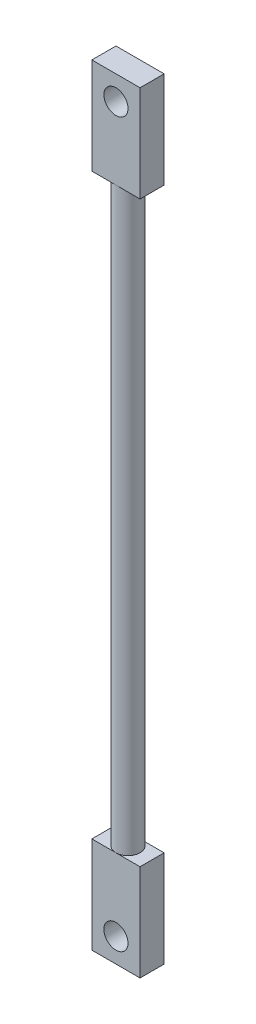
ISO-10303-21;
HEADER;
FILE_DESCRIPTION(('STEP AP214'),'2;1');
FILE_NAME('part.step','',(''),(''),'','','');
FILE_SCHEMA(('AUTOMOTIVE_DESIGN { 1 0 10303 214 1 1 1 1 }'));
ENDSEC;
DATA;
#1=APPLICATION_CONTEXT('core data for automotive mechanical design processes');
#2=APPLICATION_PROTOCOL_DEFINITION('international standard','automotive_design',2000,#1);
#3=PRODUCT_CONTEXT('',#1,'mechanical');
#4=PRODUCT('Part','Part','',(#3));
#5=PRODUCT_RELATED_PRODUCT_CATEGORY('part','',(#4));
#6=PRODUCT_DEFINITION_FORMATION('','',#4);
#7=PRODUCT_DEFINITION_CONTEXT('part definition',#1,'design');
#8=PRODUCT_DEFINITION('design','',#6,#7);
#9=PRODUCT_DEFINITION_SHAPE('','',#8);
#10=(LENGTH_UNIT() NAMED_UNIT(*) SI_UNIT(.MILLI.,.METRE.));
#11=(NAMED_UNIT(*) PLANE_ANGLE_UNIT() SI_UNIT($,.RADIAN.));
#12=(NAMED_UNIT(*) SI_UNIT($,.STERADIAN.) SOLID_ANGLE_UNIT());
#13=UNCERTAINTY_MEASURE_WITH_UNIT(LENGTH_MEASURE(1.E-05),#10,'distance_accuracy_value','');
#14=(GEOMETRIC_REPRESENTATION_CONTEXT(3) GLOBAL_UNCERTAINTY_ASSIGNED_CONTEXT((#13)) GLOBAL_UNIT_ASSIGNED_CONTEXT((#10,
#11,#12)) REPRESENTATION_CONTEXT('',''));
#15=CARTESIAN_POINT('',(0.,0.,0.));
#16=DIRECTION('',(0.,0.,1.));
#17=DIRECTION('',(1.,0.,0.));
#18=AXIS2_PLACEMENT_3D('',#15,#16,#17);
#19=CARTESIAN_POINT('',(0.,38.1,0.));
#20=DIRECTION('',(0.,-1.,0.));
#21=DIRECTION('',(0.,0.,-1.));
#22=AXIS2_PLACEMENT_3D('',#19,#20,#21);
#23=CYLINDRICAL_SURFACE('',#22,1.5875);
#24=CARTESIAN_POINT('',(0.,38.1,0.));
#25=DIRECTION('',(0.,1.,0.));
#26=DIRECTION('',(0.,0.,1.));
#27=AXIS2_PLACEMENT_3D('',#24,#25,#26);
#28=CIRCLE('',#27,1.5875);
#29=CARTESIAN_POINT('',(0.,38.1,1.5875));
#30=VERTEX_POINT('',#29);
#31=CARTESIAN_POINT('',(0.,38.1,-1.5875));
#32=VERTEX_POINT('',#31);
#33=EDGE_CURVE('E11',#30,#32,#28,.T.);
#34=ORIENTED_EDGE('',*,*,#33,.F.);
#35=EDGE_CURVE('E47',#32,#30,#28,.T.);
#36=ORIENTED_EDGE('',*,*,#35,.F.);
#37=EDGE_LOOP('',(#34,#36));
#38=FACE_BOUND('',#37,.T.);
#39=CARTESIAN_POINT('',(0.,-38.1,0.));
#40=DIRECTION('',(0.,1.,0.));
#41=DIRECTION('',(0.,0.,1.));
#42=AXIS2_PLACEMENT_3D('',#39,#40,#41);
#43=CIRCLE('',#42,1.5875);
#44=CARTESIAN_POINT('',(0.,-38.1,1.5875));
#45=VERTEX_POINT('',#44);
#46=CARTESIAN_POINT('',(0.,-38.1,-1.5875));
#47=VERTEX_POINT('',#46);
#48=EDGE_CURVE('E172',#45,#47,#43,.T.);
#49=ORIENTED_EDGE('',*,*,#48,.T.);
#50=EDGE_CURVE('E126',#47,#45,#43,.T.);
#51=ORIENTED_EDGE('',*,*,#50,.T.);
#52=EDGE_LOOP('',(#49,#51));
#53=FACE_BOUND('',#52,.T.);
#54=ADVANCED_FACE('F39',(#38,#53),#23,.T.);
#55=CARTESIAN_POINT('',(0.,38.1,0.));
#56=DIRECTION('',(0.,-1.,0.));
#57=DIRECTION('',(0.,0.,-1.));
#58=AXIS2_PLACEMENT_3D('',#55,#56,#57);
#59=PLANE('',#58);
#60=DIRECTION('',(1.,0.,0.));
#61=VECTOR('',#60,1.);
#62=CARTESIAN_POINT('',(-3.175,38.1,1.5875));
#63=LINE('',#62,#61);
#64=CARTESIAN_POINT('',(3.175,38.1,1.5875));
#65=VERTEX_POINT('',#64);
#66=EDGE_CURVE('E211',#30,#65,#63,.T.);
#67=ORIENTED_EDGE('',*,*,#66,.F.);
#68=ORIENTED_EDGE('',*,*,#33,.T.);
#69=DIRECTION('',(-1.,0.,0.));
#70=VECTOR('',#69,1.);
#71=CARTESIAN_POINT('',(-3.175,38.1,-1.5875));
#72=LINE('',#71,#70);
#73=CARTESIAN_POINT('',(3.175,38.1,-1.5875));
#74=VERTEX_POINT('',#73);
#75=EDGE_CURVE('E204',#74,#32,#72,.T.);
#76=ORIENTED_EDGE('',*,*,#75,.F.);
#77=DIRECTION('',(0.,0.,-1.));
#78=VECTOR('',#77,1.);
#79=CARTESIAN_POINT('',(3.175,38.1,1.5875));
#80=LINE('',#79,#78);
#81=EDGE_CURVE('E181',#65,#74,#80,.T.);
#82=ORIENTED_EDGE('',*,*,#81,.F.);
#83=EDGE_LOOP('',(#67,#68,#76,#82));
#84=FACE_BOUND('',#83,.T.);
#85=ADVANCED_FACE('F239',(#84),#59,.T.);
#86=CARTESIAN_POINT('',(3.175,50.8,1.5875));
#87=DIRECTION('',(-1.,0.,0.));
#88=DIRECTION('',(0.,0.,1.));
#89=AXIS2_PLACEMENT_3D('',#86,#87,#88);
#90=PLANE('',#89);
#91=ORIENTED_EDGE('',*,*,#81,.T.);
#92=DIRECTION('',(0.,-1.,0.));
#93=VECTOR('',#92,1.);
#94=CARTESIAN_POINT('',(3.175,50.8,-1.5875));
#95=LINE('',#94,#93);
#96=CARTESIAN_POINT('',(3.175,50.8,-1.5875));
#97=VERTEX_POINT('',#96);
#98=EDGE_CURVE('E225',#97,#74,#95,.T.);
#99=ORIENTED_EDGE('',*,*,#98,.F.);
#100=DIRECTION('',(0.,0.,-1.));
#101=VECTOR('',#100,1.);
#102=CARTESIAN_POINT('',(3.175,50.8,1.5875));
#103=LINE('',#102,#101);
#104=CARTESIAN_POINT('',(3.175,50.8,1.5875));
#105=VERTEX_POINT('',#104);
#106=EDGE_CURVE('E185',#105,#97,#103,.T.);
#107=ORIENTED_EDGE('',*,*,#106,.F.);
#108=DIRECTION('',(0.,-1.,0.));
#109=VECTOR('',#108,1.);
#110=CARTESIAN_POINT('',(3.175,50.8,1.5875));
#111=LINE('',#110,#109);
#112=EDGE_CURVE('E199',#105,#65,#111,.T.);
#113=ORIENTED_EDGE('',*,*,#112,.T.);
#114=EDGE_LOOP('',(#91,#99,#107,#113));
#115=FACE_BOUND('',#114,.T.);
#116=ADVANCED_FACE('F287',(#115),#90,.F.);
#117=CARTESIAN_POINT('',(-3.175,50.8,-1.5875));
#118=DIRECTION('',(0.,0.,1.));
#119=DIRECTION('',(1.,0.,0.));
#120=AXIS2_PLACEMENT_3D('',#117,#118,#119);
#121=PLANE('',#120);
#122=CARTESIAN_POINT('',(0.,47.625,-1.5875));
#123=DIRECTION('',(0.,0.,-1.));
#124=DIRECTION('',(-1.,0.,0.));
#125=AXIS2_PLACEMENT_3D('',#122,#123,#124);
#126=CIRCLE('',#125,1.5875);
#127=CARTESIAN_POINT('',(-1.5875,47.625,-1.5875));
#128=VERTEX_POINT('',#127);
#129=EDGE_CURVE('E176',#128,#128,#126,.T.);
#130=ORIENTED_EDGE('',*,*,#129,.F.);
#131=EDGE_LOOP('',(#130));
#132=FACE_BOUND('',#131,.T.);
#133=ORIENTED_EDGE('',*,*,#75,.T.);
#134=CARTESIAN_POINT('',(-3.175,38.1,-1.5875));
#135=VERTEX_POINT('',#134);
#136=EDGE_CURVE('E203',#32,#135,#72,.T.);
#137=ORIENTED_EDGE('',*,*,#136,.T.);
#138=DIRECTION('',(0.,-1.,0.));
#139=VECTOR('',#138,1.);
#140=CARTESIAN_POINT('',(-3.175,50.8,-1.5875));
#141=LINE('',#140,#139);
#142=CARTESIAN_POINT('',(-3.175,50.8,-1.5875));
#143=VERTEX_POINT('',#142);
#144=EDGE_CURVE('E222',#143,#135,#141,.T.);
#145=ORIENTED_EDGE('',*,*,#144,.F.);
#146=DIRECTION('',(-1.,0.,0.));
#147=VECTOR('',#146,1.);
#148=CARTESIAN_POINT('',(-3.175,50.8,-1.5875));
#149=LINE('',#148,#147);
#150=EDGE_CURVE('E189',#97,#143,#149,.T.);
#151=ORIENTED_EDGE('',*,*,#150,.F.);
#152=ORIENTED_EDGE('',*,*,#98,.T.);
#153=EDGE_LOOP('',(#133,#137,#145,#151,#152));
#154=FACE_BOUND('',#153,.T.);
#155=ADVANCED_FACE('F250',(#132,#154),#121,.F.);
#156=CARTESIAN_POINT('',(-3.175,50.8,1.5875));
#157=DIRECTION('',(1.,0.,0.));
#158=DIRECTION('',(0.,0.,-1.));
#159=AXIS2_PLACEMENT_3D('',#156,#157,#158);
#160=PLANE('',#159);
#161=DIRECTION('',(0.,0.,1.));
#162=VECTOR('',#161,1.);
#163=CARTESIAN_POINT('',(-3.175,38.1,1.5875));
#164=LINE('',#163,#162);
#165=CARTESIAN_POINT('',(-3.175,38.1,1.5875));
#166=VERTEX_POINT('',#165);
#167=EDGE_CURVE('E208',#135,#166,#164,.T.);
#168=ORIENTED_EDGE('',*,*,#167,.T.);
#169=DIRECTION('',(0.,-1.,0.));
#170=VECTOR('',#169,1.);
#171=CARTESIAN_POINT('',(-3.175,50.8,1.5875));
#172=LINE('',#171,#170);
#173=CARTESIAN_POINT('',(-3.175,50.8,1.5875));
#174=VERTEX_POINT('',#173);
#175=EDGE_CURVE('E218',#174,#166,#172,.T.);
#176=ORIENTED_EDGE('',*,*,#175,.F.);
#177=DIRECTION('',(0.,0.,1.));
#178=VECTOR('',#177,1.);
#179=CARTESIAN_POINT('',(-3.175,50.8,1.5875));
#180=LINE('',#179,#178);
#181=EDGE_CURVE('E193',#143,#174,#180,.T.);
#182=ORIENTED_EDGE('',*,*,#181,.F.);
#183=ORIENTED_EDGE('',*,*,#144,.T.);
#184=EDGE_LOOP('',(#168,#176,#182,#183));
#185=FACE_BOUND('',#184,.T.);
#186=ADVANCED_FACE('F248',(#185),#160,.F.);
#187=CARTESIAN_POINT('',(-3.175,50.8,1.5875));
#188=DIRECTION('',(0.,0.,-1.));
#189=DIRECTION('',(-1.,0.,0.));
#190=AXIS2_PLACEMENT_3D('',#187,#188,#189);
#191=PLANE('',#190);
#192=CARTESIAN_POINT('',(0.,47.625,1.5875));
#193=DIRECTION('',(0.,0.,-1.));
#194=DIRECTION('',(-1.,0.,0.));
#195=AXIS2_PLACEMENT_3D('',#192,#193,#194);
#196=CIRCLE('',#195,1.5875);
#197=CARTESIAN_POINT('',(-1.5875,47.625,1.5875));
#198=VERTEX_POINT('',#197);
#199=EDGE_CURVE('E177',#198,#198,#196,.T.);
#200=ORIENTED_EDGE('',*,*,#199,.T.);
#201=EDGE_LOOP('',(#200));
#202=FACE_BOUND('',#201,.T.);
#203=EDGE_CURVE('E190',#166,#30,#63,.T.);
#204=ORIENTED_EDGE('',*,*,#203,.T.);
#205=ORIENTED_EDGE('',*,*,#66,.T.);
#206=ORIENTED_EDGE('',*,*,#112,.F.);
#207=DIRECTION('',(1.,0.,0.));
#208=VECTOR('',#207,1.);
#209=CARTESIAN_POINT('',(-3.175,50.8,1.5875));
#210=LINE('',#209,#208);
#211=EDGE_CURVE('E196',#174,#105,#210,.T.);
#212=ORIENTED_EDGE('',*,*,#211,.F.);
#213=ORIENTED_EDGE('',*,*,#175,.T.);
#214=EDGE_LOOP('',(#204,#205,#206,#212,#213));
#215=FACE_BOUND('',#214,.T.);
#216=ADVANCED_FACE('F243',(#202,#215),#191,.F.);
#217=CARTESIAN_POINT('',(0.,50.8,0.));
#218=DIRECTION('',(0.,-1.,0.));
#219=DIRECTION('',(0.,0.,-1.));
#220=AXIS2_PLACEMENT_3D('',#217,#218,#219);
#221=PLANE('',#220);
#222=ORIENTED_EDGE('',*,*,#106,.T.);
#223=ORIENTED_EDGE('',*,*,#150,.T.);
#224=ORIENTED_EDGE('',*,*,#181,.T.);
#225=ORIENTED_EDGE('',*,*,#211,.T.);
#226=EDGE_LOOP('',(#222,#223,#224,#225));
#227=FACE_BOUND('',#226,.T.);
#228=ADVANCED_FACE('F297',(#227),#221,.F.);
#229=ORIENTED_EDGE('',*,*,#136,.F.);
#230=ORIENTED_EDGE('',*,*,#35,.T.);
#231=ORIENTED_EDGE('',*,*,#203,.F.);
#232=ORIENTED_EDGE('',*,*,#167,.F.);
#233=EDGE_LOOP('',(#229,#230,#231,#232));
#234=FACE_BOUND('',#233,.T.);
#235=ADVANCED_FACE('F235',(#234),#59,.T.);
#236=CARTESIAN_POINT('',(0.,47.625,1.5875));
#237=DIRECTION('',(0.,0.,-1.));
#238=DIRECTION('',(-1.,0.,0.));
#239=AXIS2_PLACEMENT_3D('',#236,#237,#238);
#240=CYLINDRICAL_SURFACE('',#239,1.5875);
#241=ORIENTED_EDGE('',*,*,#199,.F.);
#242=EDGE_LOOP('',(#241));
#243=FACE_BOUND('',#242,.T.);
#244=ORIENTED_EDGE('',*,*,#129,.T.);
#245=EDGE_LOOP('',(#244));
#246=FACE_BOUND('',#245,.T.);
#247=ADVANCED_FACE('F296',(#243,#246),#240,.F.);
#248=CARTESIAN_POINT('',(0.,-38.1,0.));
#249=DIRECTION('',(0.,1.,0.));
#250=DIRECTION('',(0.,0.,-1.));
#251=AXIS2_PLACEMENT_3D('',#248,#249,#250);
#252=PLANE('',#251);
#253=ORIENTED_EDGE('',*,*,#48,.F.);
#254=DIRECTION('',(1.,0.,0.));
#255=VECTOR('',#254,1.);
#256=CARTESIAN_POINT('',(-3.175,-38.1,1.5875));
#257=LINE('',#256,#255);
#258=CARTESIAN_POINT('',(3.175,-38.1,1.5875));
#259=VERTEX_POINT('',#258);
#260=EDGE_CURVE('E153',#45,#259,#257,.T.);
#261=ORIENTED_EDGE('',*,*,#260,.T.);
#262=DIRECTION('',(0.,0.,-1.));
#263=VECTOR('',#262,1.);
#264=CARTESIAN_POINT('',(3.175,-38.1,1.5875));
#265=LINE('',#264,#263);
#266=CARTESIAN_POINT('',(3.175,-38.1,-1.5875));
#267=VERTEX_POINT('',#266);
#268=EDGE_CURVE('E122',#259,#267,#265,.T.);
#269=ORIENTED_EDGE('',*,*,#268,.T.);
#270=DIRECTION('',(-1.,0.,0.));
#271=VECTOR('',#270,1.);
#272=CARTESIAN_POINT('',(-3.175,-38.1,-1.5875));
#273=LINE('',#272,#271);
#274=EDGE_CURVE('E138',#267,#47,#273,.T.);
#275=ORIENTED_EDGE('',*,*,#274,.T.);
#276=EDGE_LOOP('',(#253,#261,#269,#275));
#277=FACE_BOUND('',#276,.T.);
#278=ADVANCED_FACE('F264',(#277),#252,.T.);
#279=ORIENTED_EDGE('',*,*,#50,.F.);
#280=CARTESIAN_POINT('',(-3.175,-38.1,-1.5875));
#281=VERTEX_POINT('',#280);
#282=EDGE_CURVE('E160',#47,#281,#273,.T.);
#283=ORIENTED_EDGE('',*,*,#282,.T.);
#284=DIRECTION('',(0.,0.,1.));
#285=VECTOR('',#284,1.);
#286=CARTESIAN_POINT('',(-3.175,-38.1,1.5875));
#287=LINE('',#286,#285);
#288=CARTESIAN_POINT('',(-3.175,-38.1,1.5875));
#289=VERTEX_POINT('',#288);
#290=EDGE_CURVE('E157',#281,#289,#287,.T.);
#291=ORIENTED_EDGE('',*,*,#290,.T.);
#292=EDGE_CURVE('E54',#289,#45,#257,.T.);
#293=ORIENTED_EDGE('',*,*,#292,.T.);
#294=EDGE_LOOP('',(#279,#283,#291,#293));
#295=FACE_BOUND('',#294,.T.);
#296=ADVANCED_FACE('F257',(#295),#252,.T.);
#297=CARTESIAN_POINT('',(3.175,-50.8,1.5875));
#298=DIRECTION('',(1.,0.,0.));
#299=DIRECTION('',(0.,0.,-1.));
#300=AXIS2_PLACEMENT_3D('',#297,#298,#299);
#301=PLANE('',#300);
#302=ORIENTED_EDGE('',*,*,#268,.F.);
#303=DIRECTION('',(0.,1.,0.));
#304=VECTOR('',#303,1.);
#305=CARTESIAN_POINT('',(3.175,-50.8,1.5875));
#306=LINE('',#305,#304);
#307=CARTESIAN_POINT('',(3.175,-50.8,1.5875));
#308=VERTEX_POINT('',#307);
#309=EDGE_CURVE('E116',#308,#259,#306,.T.);
#310=ORIENTED_EDGE('',*,*,#309,.F.);
#311=DIRECTION('',(0.,0.,-1.));
#312=VECTOR('',#311,1.);
#313=CARTESIAN_POINT('',(3.175,-50.8,1.5875));
#314=LINE('',#313,#312);
#315=CARTESIAN_POINT('',(3.175,-50.8,-1.5875));
#316=VERTEX_POINT('',#315);
#317=EDGE_CURVE('E119',#308,#316,#314,.T.);
#318=ORIENTED_EDGE('',*,*,#317,.T.);
#319=DIRECTION('',(0.,1.,0.));
#320=VECTOR('',#319,1.);
#321=CARTESIAN_POINT('',(3.175,-50.8,-1.5875));
#322=LINE('',#321,#320);
#323=EDGE_CURVE('E150',#316,#267,#322,.T.);
#324=ORIENTED_EDGE('',*,*,#323,.T.);
#325=EDGE_LOOP('',(#302,#310,#318,#324));
#326=FACE_BOUND('',#325,.T.);
#327=ADVANCED_FACE('F118',(#326),#301,.T.);
#328=CARTESIAN_POINT('',(-3.175,-50.8,1.5875));
#329=DIRECTION('',(0.,0.,1.));
#330=DIRECTION('',(1.,0.,0.));
#331=AXIS2_PLACEMENT_3D('',#328,#329,#330);
#332=PLANE('',#331);
#333=CARTESIAN_POINT('',(0.,-47.625,1.5875));
#334=DIRECTION('',(0.,0.,1.));
#335=DIRECTION('',(-1.,0.,0.));
#336=AXIS2_PLACEMENT_3D('',#333,#334,#335);
#337=CIRCLE('',#336,1.5875);
#338=CARTESIAN_POINT('',(-1.5875,-47.625,1.5875));
#339=VERTEX_POINT('',#338);
#340=EDGE_CURVE('E154',#339,#339,#337,.T.);
#341=ORIENTED_EDGE('',*,*,#340,.F.);
#342=EDGE_LOOP('',(#341));
#343=FACE_BOUND('',#342,.T.);
#344=ORIENTED_EDGE('',*,*,#292,.F.);
#345=DIRECTION('',(0.,1.,0.));
#346=VECTOR('',#345,1.);
#347=CARTESIAN_POINT('',(-3.175,-50.8,1.5875));
#348=LINE('',#347,#346);
#349=CARTESIAN_POINT('',(-3.175,-50.8,1.5875));
#350=VERTEX_POINT('',#349);
#351=EDGE_CURVE('E127',#350,#289,#348,.T.);
#352=ORIENTED_EDGE('',*,*,#351,.F.);
#353=DIRECTION('',(1.,0.,0.));
#354=VECTOR('',#353,1.);
#355=CARTESIAN_POINT('',(-3.175,-50.8,1.5875));
#356=LINE('',#355,#354);
#357=EDGE_CURVE('E133',#350,#308,#356,.T.);
#358=ORIENTED_EDGE('',*,*,#357,.T.);
#359=ORIENTED_EDGE('',*,*,#309,.T.);
#360=ORIENTED_EDGE('',*,*,#260,.F.);
#361=EDGE_LOOP('',(#344,#352,#358,#359,#360));
#362=FACE_BOUND('',#361,.T.);
#363=ADVANCED_FACE('F140',(#343,#362),#332,.T.);
#364=CARTESIAN_POINT('',(-3.175,-50.8,1.5875));
#365=DIRECTION('',(-1.,0.,0.));
#366=DIRECTION('',(0.,0.,1.));
#367=AXIS2_PLACEMENT_3D('',#364,#365,#366);
#368=PLANE('',#367);
#369=ORIENTED_EDGE('',*,*,#290,.F.);
#370=DIRECTION('',(0.,1.,0.));
#371=VECTOR('',#370,1.);
#372=CARTESIAN_POINT('',(-3.175,-50.8,-1.5875));
#373=LINE('',#372,#371);
#374=CARTESIAN_POINT('',(-3.175,-50.8,-1.5875));
#375=VERTEX_POINT('',#374);
#376=EDGE_CURVE('E166',#375,#281,#373,.T.);
#377=ORIENTED_EDGE('',*,*,#376,.F.);
#378=DIRECTION('',(0.,0.,1.));
#379=VECTOR('',#378,1.);
#380=CARTESIAN_POINT('',(-3.175,-50.8,1.5875));
#381=LINE('',#380,#379);
#382=EDGE_CURVE('E142',#375,#350,#381,.T.);
#383=ORIENTED_EDGE('',*,*,#382,.T.);
#384=ORIENTED_EDGE('',*,*,#351,.T.);
#385=EDGE_LOOP('',(#369,#377,#383,#384));
#386=FACE_BOUND('',#385,.T.);
#387=ADVANCED_FACE('F314',(#386),#368,.T.);
#388=CARTESIAN_POINT('',(-3.175,-50.8,-1.5875));
#389=DIRECTION('',(0.,0.,-1.));
#390=DIRECTION('',(-1.,0.,0.));
#391=AXIS2_PLACEMENT_3D('',#388,#389,#390);
#392=PLANE('',#391);
#393=CARTESIAN_POINT('',(0.,-47.625,-1.5875));
#394=DIRECTION('',(0.,0.,1.));
#395=DIRECTION('',(-1.,0.,0.));
#396=AXIS2_PLACEMENT_3D('',#393,#394,#395);
#397=CIRCLE('',#396,1.5875);
#398=CARTESIAN_POINT('',(-1.5875,-47.625,-1.5875));
#399=VERTEX_POINT('',#398);
#400=EDGE_CURVE('E269',#399,#399,#397,.T.);
#401=ORIENTED_EDGE('',*,*,#400,.T.);
#402=EDGE_LOOP('',(#401));
#403=FACE_BOUND('',#402,.T.);
#404=ORIENTED_EDGE('',*,*,#274,.F.);
#405=ORIENTED_EDGE('',*,*,#323,.F.);
#406=DIRECTION('',(-1.,0.,0.));
#407=VECTOR('',#406,1.);
#408=CARTESIAN_POINT('',(-3.175,-50.8,-1.5875));
#409=LINE('',#408,#407);
#410=EDGE_CURVE('E136',#316,#375,#409,.T.);
#411=ORIENTED_EDGE('',*,*,#410,.T.);
#412=ORIENTED_EDGE('',*,*,#376,.T.);
#413=ORIENTED_EDGE('',*,*,#282,.F.);
#414=EDGE_LOOP('',(#404,#405,#411,#412,#413));
#415=FACE_BOUND('',#414,.T.);
#416=ADVANCED_FACE('F260',(#403,#415),#392,.T.);
#417=CARTESIAN_POINT('',(0.,-50.8,0.));
#418=DIRECTION('',(0.,1.,0.));
#419=DIRECTION('',(0.,0.,-1.));
#420=AXIS2_PLACEMENT_3D('',#417,#418,#419);
#421=PLANE('',#420);
#422=ORIENTED_EDGE('',*,*,#317,.F.);
#423=ORIENTED_EDGE('',*,*,#357,.F.);
#424=ORIENTED_EDGE('',*,*,#382,.F.);
#425=ORIENTED_EDGE('',*,*,#410,.F.);
#426=EDGE_LOOP('',(#422,#423,#424,#425));
#427=FACE_BOUND('',#426,.T.);
#428=ADVANCED_FACE('F131',(#427),#421,.F.);
#429=CARTESIAN_POINT('',(0.,-47.625,1.5875));
#430=DIRECTION('',(0.,0.,-1.));
#431=DIRECTION('',(-1.,0.,0.));
#432=AXIS2_PLACEMENT_3D('',#429,#430,#431);
#433=CYLINDRICAL_SURFACE('',#432,1.5875);
#434=ORIENTED_EDGE('',*,*,#340,.T.);
#435=EDGE_LOOP('',(#434));
#436=FACE_BOUND('',#435,.T.);
#437=ORIENTED_EDGE('',*,*,#400,.F.);
#438=EDGE_LOOP('',(#437));
#439=FACE_BOUND('',#438,.T.);
#440=ADVANCED_FACE('F275',(#436,#439),#433,.F.);
#441=CLOSED_SHELL('',(#54,#85,#116,#155,#186,#216,#228,#235,#247,#278,#296,#327,#363,#387,#416,
#428,#440));
#442=MANIFOLD_SOLID_BREP('B2',#441);
#443=ADVANCED_BREP_SHAPE_REPRESENTATION('',(#18,#442),#14);
#444=SHAPE_DEFINITION_REPRESENTATION(#9,#443);
ENDSEC;
END-ISO-10303-21;
